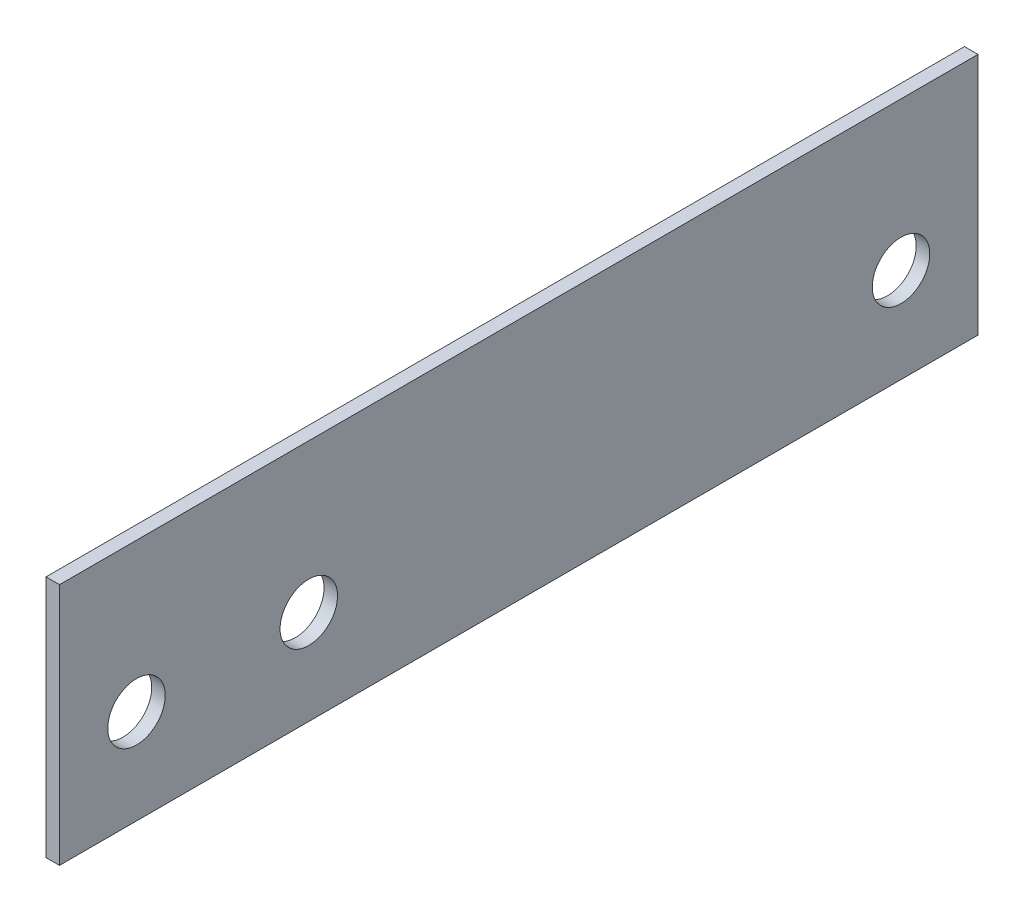
ISO-10303-21;
HEADER;
FILE_DESCRIPTION(('STEP AP214'),'2;1');
FILE_NAME('part.step','',(''),(''),'','','');
FILE_SCHEMA(('AUTOMOTIVE_DESIGN { 1 0 10303 214 1 1 1 1 }'));
ENDSEC;
DATA;
#1=APPLICATION_CONTEXT('core data for automotive mechanical design processes');
#2=APPLICATION_PROTOCOL_DEFINITION('international standard','automotive_design',2000,#1);
#3=PRODUCT_CONTEXT('',#1,'mechanical');
#4=PRODUCT('Part','Part','',(#3));
#5=PRODUCT_RELATED_PRODUCT_CATEGORY('part','',(#4));
#6=PRODUCT_DEFINITION_FORMATION('','',#4);
#7=PRODUCT_DEFINITION_CONTEXT('part definition',#1,'design');
#8=PRODUCT_DEFINITION('design','',#6,#7);
#9=PRODUCT_DEFINITION_SHAPE('','',#8);
#10=(LENGTH_UNIT() NAMED_UNIT(*) SI_UNIT(.MILLI.,.METRE.));
#11=(NAMED_UNIT(*) PLANE_ANGLE_UNIT() SI_UNIT($,.RADIAN.));
#12=(NAMED_UNIT(*) SI_UNIT($,.STERADIAN.) SOLID_ANGLE_UNIT());
#13=UNCERTAINTY_MEASURE_WITH_UNIT(LENGTH_MEASURE(1.E-05),#10,'distance_accuracy_value','');
#14=(GEOMETRIC_REPRESENTATION_CONTEXT(3) GLOBAL_UNCERTAINTY_ASSIGNED_CONTEXT((#13)) GLOBAL_UNIT_ASSIGNED_CONTEXT((#10,
#11,#12)) REPRESENTATION_CONTEXT('',''));
#15=CARTESIAN_POINT('',(0.,0.,0.));
#16=DIRECTION('',(0.,0.,1.));
#17=DIRECTION('',(1.,0.,0.));
#18=AXIS2_PLACEMENT_3D('',#15,#16,#17);
#19=CARTESIAN_POINT('',(1.5875,-14.2875,53.975));
#20=DIRECTION('',(0.,1.,0.));
#21=DIRECTION('',(0.,0.,1.));
#22=AXIS2_PLACEMENT_3D('',#19,#20,#21);
#23=PLANE('',#22);
#24=DIRECTION('',(0.,0.,-1.));
#25=VECTOR('',#24,1.);
#26=CARTESIAN_POINT('',(0.,-14.2875,53.975));
#27=LINE('',#26,#25);
#28=CARTESIAN_POINT('',(0.,-14.2875,53.975));
#29=VERTEX_POINT('',#28);
#30=CARTESIAN_POINT('',(0.,-14.2875,-53.975));
#31=VERTEX_POINT('',#30);
#32=EDGE_CURVE('E112',#29,#31,#27,.T.);
#33=ORIENTED_EDGE('',*,*,#32,.T.);
#34=DIRECTION('',(-1.,0.,0.));
#35=VECTOR('',#34,1.);
#36=CARTESIAN_POINT('',(1.5875,-14.2875,-53.975));
#37=LINE('',#36,#35);
#38=CARTESIAN_POINT('',(1.5875,-14.2875,-53.975));
#39=VERTEX_POINT('',#38);
#40=EDGE_CURVE('E11',#39,#31,#37,.T.);
#41=ORIENTED_EDGE('',*,*,#40,.F.);
#42=DIRECTION('',(0.,0.,-1.));
#43=VECTOR('',#42,1.);
#44=CARTESIAN_POINT('',(1.5875,-14.2875,53.975));
#45=LINE('',#44,#43);
#46=CARTESIAN_POINT('',(1.5875,-14.2875,53.975));
#47=VERTEX_POINT('',#46);
#48=EDGE_CURVE('E92',#47,#39,#45,.T.);
#49=ORIENTED_EDGE('',*,*,#48,.F.);
#50=DIRECTION('',(-1.,0.,0.));
#51=VECTOR('',#50,1.);
#52=CARTESIAN_POINT('',(1.5875,-14.2875,53.975));
#53=LINE('',#52,#51);
#54=EDGE_CURVE('E59',#47,#29,#53,.T.);
#55=ORIENTED_EDGE('',*,*,#54,.T.);
#56=EDGE_LOOP('',(#33,#41,#49,#55));
#57=FACE_BOUND('',#56,.T.);
#58=ADVANCED_FACE('F40',(#57),#23,.F.);
#59=CARTESIAN_POINT('',(1.5875,-14.2875,-53.975));
#60=DIRECTION('',(0.,0.,1.));
#61=DIRECTION('',(1.,0.,0.));
#62=AXIS2_PLACEMENT_3D('',#59,#60,#61);
#63=PLANE('',#62);
#64=DIRECTION('',(0.,1.,0.));
#65=VECTOR('',#64,1.);
#66=CARTESIAN_POINT('',(0.,-14.2875,-53.975));
#67=LINE('',#66,#65);
#68=CARTESIAN_POINT('',(0.,14.2875,-53.975));
#69=VERTEX_POINT('',#68);
#70=EDGE_CURVE('E98',#31,#69,#67,.T.);
#71=ORIENTED_EDGE('',*,*,#70,.T.);
#72=DIRECTION('',(-1.,0.,0.));
#73=VECTOR('',#72,1.);
#74=CARTESIAN_POINT('',(1.5875,14.2875,-53.975));
#75=LINE('',#74,#73);
#76=CARTESIAN_POINT('',(1.5875,14.2875,-53.975));
#77=VERTEX_POINT('',#76);
#78=EDGE_CURVE('E50',#77,#69,#75,.T.);
#79=ORIENTED_EDGE('',*,*,#78,.F.);
#80=DIRECTION('',(0.,1.,0.));
#81=VECTOR('',#80,1.);
#82=CARTESIAN_POINT('',(1.5875,-14.2875,-53.975));
#83=LINE('',#82,#81);
#84=EDGE_CURVE('E84',#39,#77,#83,.T.);
#85=ORIENTED_EDGE('',*,*,#84,.F.);
#86=ORIENTED_EDGE('',*,*,#40,.T.);
#87=EDGE_LOOP('',(#71,#79,#85,#86));
#88=FACE_BOUND('',#87,.T.);
#89=ADVANCED_FACE('F97',(#88),#63,.F.);
#90=CARTESIAN_POINT('',(1.5875,14.2875,53.975));
#91=DIRECTION('',(0.,1.,0.));
#92=DIRECTION('',(0.,0.,1.));
#93=AXIS2_PLACEMENT_3D('',#90,#91,#92);
#94=PLANE('',#93);
#95=DIRECTION('',(0.,0.,-1.));
#96=VECTOR('',#95,1.);
#97=CARTESIAN_POINT('',(0.,14.2875,53.975));
#98=LINE('',#97,#96);
#99=CARTESIAN_POINT('',(0.,14.2875,53.975));
#100=VERTEX_POINT('',#99);
#101=EDGE_CURVE('E118',#100,#69,#98,.T.);
#102=ORIENTED_EDGE('',*,*,#101,.F.);
#103=DIRECTION('',(-1.,0.,0.));
#104=VECTOR('',#103,1.);
#105=CARTESIAN_POINT('',(1.5875,14.2875,53.975));
#106=LINE('',#105,#104);
#107=CARTESIAN_POINT('',(1.5875,14.2875,53.975));
#108=VERTEX_POINT('',#107);
#109=EDGE_CURVE('E73',#108,#100,#106,.T.);
#110=ORIENTED_EDGE('',*,*,#109,.F.);
#111=DIRECTION('',(0.,0.,-1.));
#112=VECTOR('',#111,1.);
#113=CARTESIAN_POINT('',(1.5875,14.2875,53.975));
#114=LINE('',#113,#112);
#115=EDGE_CURVE('E91',#108,#77,#114,.T.);
#116=ORIENTED_EDGE('',*,*,#115,.T.);
#117=ORIENTED_EDGE('',*,*,#78,.T.);
#118=EDGE_LOOP('',(#102,#110,#116,#117));
#119=FACE_BOUND('',#118,.T.);
#120=ADVANCED_FACE('F103',(#119),#94,.T.);
#121=CARTESIAN_POINT('',(1.5875,-14.2875,53.975));
#122=DIRECTION('',(0.,0.,1.));
#123=DIRECTION('',(1.,0.,0.));
#124=AXIS2_PLACEMENT_3D('',#121,#122,#123);
#125=PLANE('',#124);
#126=DIRECTION('',(0.,1.,0.));
#127=VECTOR('',#126,1.);
#128=CARTESIAN_POINT('',(0.,-14.2875,53.975));
#129=LINE('',#128,#127);
#130=EDGE_CURVE('E121',#29,#100,#129,.T.);
#131=ORIENTED_EDGE('',*,*,#130,.F.);
#132=ORIENTED_EDGE('',*,*,#54,.F.);
#133=DIRECTION('',(0.,1.,0.));
#134=VECTOR('',#133,1.);
#135=CARTESIAN_POINT('',(1.5875,-14.2875,53.975));
#136=LINE('',#135,#134);
#137=EDGE_CURVE('E105',#47,#108,#136,.T.);
#138=ORIENTED_EDGE('',*,*,#137,.T.);
#139=ORIENTED_EDGE('',*,*,#109,.T.);
#140=EDGE_LOOP('',(#131,#132,#138,#139));
#141=FACE_BOUND('',#140,.T.);
#142=ADVANCED_FACE('F176',(#141),#125,.T.);
#143=CARTESIAN_POINT('',(1.5875,0.,0.));
#144=DIRECTION('',(1.,0.,0.));
#145=DIRECTION('',(0.,0.,-1.));
#146=AXIS2_PLACEMENT_3D('',#143,#144,#145);
#147=PLANE('',#146);
#148=CARTESIAN_POINT('',(1.58749999999999,-3.17500000000002,24.6750840488247));
#149=DIRECTION('',(-1.,0.,0.));
#150=DIRECTION('',(0.,0.,1.));
#151=AXIS2_PLACEMENT_3D('',#148,#149,#150);
#152=CIRCLE('',#151,3.37819999999998);
#153=CARTESIAN_POINT('',(1.58749999999999,-3.17500000000002,28.0532840488247));
#154=VERTEX_POINT('',#153);
#155=EDGE_CURVE('E150',#154,#154,#152,.T.);
#156=ORIENTED_EDGE('',*,*,#155,.T.);
#157=EDGE_LOOP('',(#156));
#158=FACE_BOUND('',#157,.T.);
#159=CARTESIAN_POINT('',(1.58749999999999,-3.17500000000002,44.9255616018356));
#160=DIRECTION('',(-1.,0.,0.));
#161=DIRECTION('',(0.,0.,1.));
#162=AXIS2_PLACEMENT_3D('',#159,#160,#161);
#163=CIRCLE('',#162,3.37819999999998);
#164=CARTESIAN_POINT('',(1.58749999999999,-3.17500000000002,48.3037616018356));
#165=VERTEX_POINT('',#164);
#166=EDGE_CURVE('E138',#165,#165,#163,.T.);
#167=ORIENTED_EDGE('',*,*,#166,.T.);
#168=EDGE_LOOP('',(#167));
#169=FACE_BOUND('',#168,.T.);
#170=CARTESIAN_POINT('',(1.58749999999999,-3.175,-44.9255616018355));
#171=DIRECTION('',(-1.,0.,0.));
#172=DIRECTION('',(0.,0.,1.));
#173=AXIS2_PLACEMENT_3D('',#170,#171,#172);
#174=CIRCLE('',#173,3.37819999999998);
#175=CARTESIAN_POINT('',(1.58749999999999,-3.175,-41.5473616018356));
#176=VERTEX_POINT('',#175);
#177=EDGE_CURVE('E129',#176,#176,#174,.T.);
#178=ORIENTED_EDGE('',*,*,#177,.T.);
#179=EDGE_LOOP('',(#178));
#180=FACE_BOUND('',#179,.T.);
#181=ORIENTED_EDGE('',*,*,#48,.T.);
#182=ORIENTED_EDGE('',*,*,#84,.T.);
#183=ORIENTED_EDGE('',*,*,#115,.F.);
#184=ORIENTED_EDGE('',*,*,#137,.F.);
#185=EDGE_LOOP('',(#181,#182,#183,#184));
#186=FACE_BOUND('',#185,.T.);
#187=ADVANCED_FACE('F88',(#158,#169,#180,#186),#147,.T.);
#188=CARTESIAN_POINT('',(0.,0.,0.));
#189=DIRECTION('',(1.,0.,0.));
#190=DIRECTION('',(0.,0.,-1.));
#191=AXIS2_PLACEMENT_3D('',#188,#189,#190);
#192=PLANE('',#191);
#193=CARTESIAN_POINT('',(0.,-3.17500000000002,24.6750840488247));
#194=DIRECTION('',(1.,0.,0.));
#195=DIRECTION('',(0.,0.,-1.));
#196=AXIS2_PLACEMENT_3D('',#193,#194,#195);
#197=CIRCLE('',#196,3.37819999999999);
#198=CARTESIAN_POINT('',(0.,-3.17500000000002,21.2968840488247));
#199=VERTEX_POINT('',#198);
#200=EDGE_CURVE('E43',#199,#199,#197,.T.);
#201=ORIENTED_EDGE('',*,*,#200,.T.);
#202=EDGE_LOOP('',(#201));
#203=FACE_BOUND('',#202,.T.);
#204=CARTESIAN_POINT('',(0.,-3.17500000000002,44.9255616018356));
#205=DIRECTION('',(1.,0.,0.));
#206=DIRECTION('',(0.,0.,-1.));
#207=AXIS2_PLACEMENT_3D('',#204,#205,#206);
#208=CIRCLE('',#207,3.37819999999999);
#209=CARTESIAN_POINT('',(0.,-3.17500000000002,41.5473616018356));
#210=VERTEX_POINT('',#209);
#211=EDGE_CURVE('E133',#210,#210,#208,.T.);
#212=ORIENTED_EDGE('',*,*,#211,.T.);
#213=EDGE_LOOP('',(#212));
#214=FACE_BOUND('',#213,.T.);
#215=CARTESIAN_POINT('',(0.,-3.175,-44.9255616018355));
#216=DIRECTION('',(1.,0.,0.));
#217=DIRECTION('',(0.,0.,-1.));
#218=AXIS2_PLACEMENT_3D('',#215,#216,#217);
#219=CIRCLE('',#218,3.37819999999999);
#220=CARTESIAN_POINT('',(0.,-3.175,-48.3037616018355));
#221=VERTEX_POINT('',#220);
#222=EDGE_CURVE('E115',#221,#221,#219,.T.);
#223=ORIENTED_EDGE('',*,*,#222,.T.);
#224=EDGE_LOOP('',(#223));
#225=FACE_BOUND('',#224,.T.);
#226=ORIENTED_EDGE('',*,*,#32,.F.);
#227=ORIENTED_EDGE('',*,*,#130,.T.);
#228=ORIENTED_EDGE('',*,*,#101,.T.);
#229=ORIENTED_EDGE('',*,*,#70,.F.);
#230=EDGE_LOOP('',(#226,#227,#228,#229));
#231=FACE_BOUND('',#230,.T.);
#232=ADVANCED_FACE('F157',(#203,#214,#225,#231),#192,.F.);
#233=CARTESIAN_POINT('',(-6.34999999999999,-3.175,-44.9255616018355));
#234=DIRECTION('',(-1.,0.,0.));
#235=DIRECTION('',(0.,0.,1.));
#236=AXIS2_PLACEMENT_3D('',#233,#234,#235);
#237=CYLINDRICAL_SURFACE('',#236,3.37819999999999);
#238=ORIENTED_EDGE('',*,*,#177,.F.);
#239=EDGE_LOOP('',(#238));
#240=FACE_BOUND('',#239,.T.);
#241=ORIENTED_EDGE('',*,*,#222,.F.);
#242=EDGE_LOOP('',(#241));
#243=FACE_BOUND('',#242,.T.);
#244=ADVANCED_FACE('F168',(#240,#243),#237,.F.);
#245=CARTESIAN_POINT('',(-6.34999999999999,-3.17500000000002,44.9255616018356));
#246=DIRECTION('',(-1.,0.,0.));
#247=DIRECTION('',(0.,0.,1.));
#248=AXIS2_PLACEMENT_3D('',#245,#246,#247);
#249=CYLINDRICAL_SURFACE('',#248,3.37819999999999);
#250=ORIENTED_EDGE('',*,*,#166,.F.);
#251=EDGE_LOOP('',(#250));
#252=FACE_BOUND('',#251,.T.);
#253=ORIENTED_EDGE('',*,*,#211,.F.);
#254=EDGE_LOOP('',(#253));
#255=FACE_BOUND('',#254,.T.);
#256=ADVANCED_FACE('F162',(#252,#255),#249,.F.);
#257=CARTESIAN_POINT('',(-6.34999999999999,-3.17500000000002,24.6750840488247));
#258=DIRECTION('',(-1.,0.,0.));
#259=DIRECTION('',(0.,0.,1.));
#260=AXIS2_PLACEMENT_3D('',#257,#258,#259);
#261=CYLINDRICAL_SURFACE('',#260,3.37819999999999);
#262=ORIENTED_EDGE('',*,*,#155,.F.);
#263=EDGE_LOOP('',(#262));
#264=FACE_BOUND('',#263,.T.);
#265=ORIENTED_EDGE('',*,*,#200,.F.);
#266=EDGE_LOOP('',(#265));
#267=FACE_BOUND('',#266,.T.);
#268=ADVANCED_FACE('F160',(#264,#267),#261,.F.);
#269=CLOSED_SHELL('',(#58,#89,#120,#142,#187,#232,#244,#256,#268));
#270=MANIFOLD_SOLID_BREP('B2',#269);
#271=ADVANCED_BREP_SHAPE_REPRESENTATION('',(#18,#270),#14);
#272=SHAPE_DEFINITION_REPRESENTATION(#9,#271);
ENDSEC;
END-ISO-10303-21;
